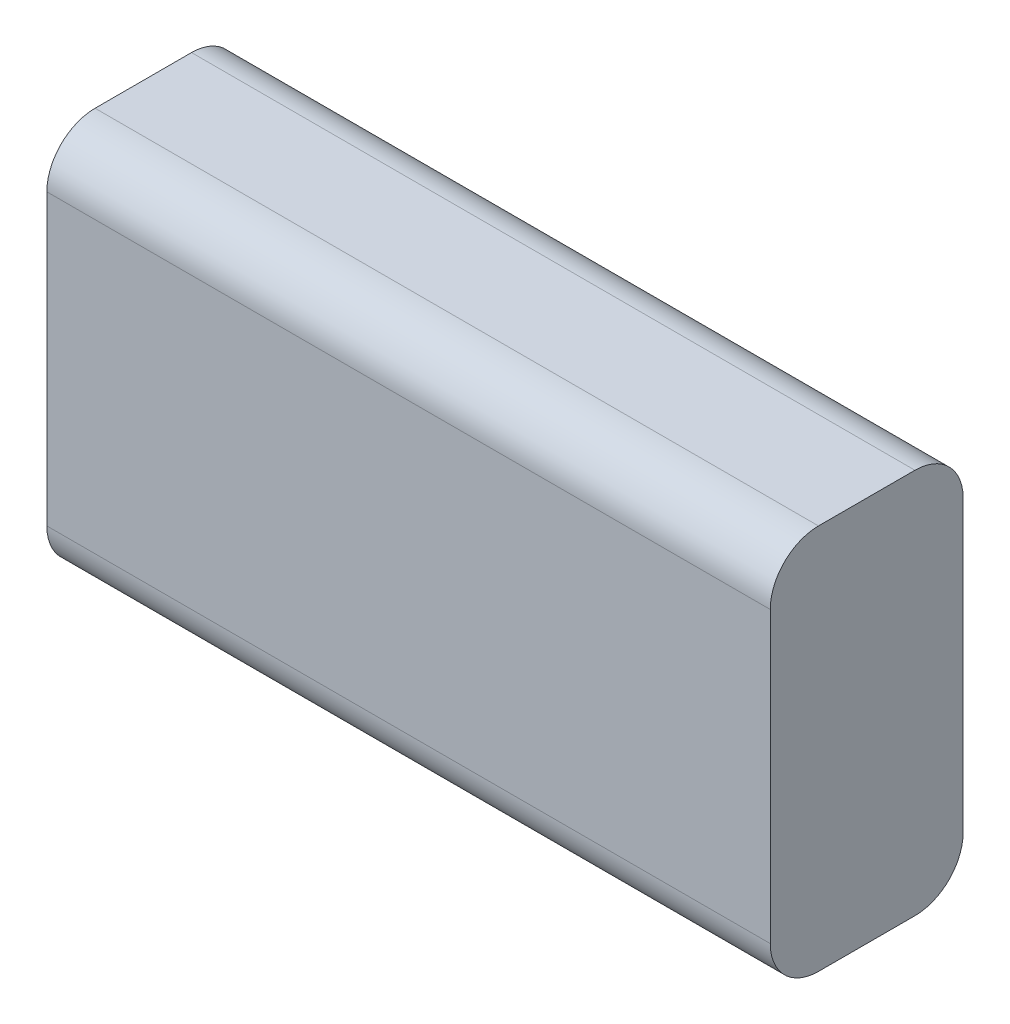
ISO-10303-21;
HEADER;
FILE_DESCRIPTION(('STEP AP214'),'2;1');
FILE_NAME('part.step','',(''),(''),'','','');
FILE_SCHEMA(('AUTOMOTIVE_DESIGN { 1 0 10303 214 1 1 1 1 }'));
ENDSEC;
DATA;
#1=APPLICATION_CONTEXT('core data for automotive mechanical design processes');
#2=APPLICATION_PROTOCOL_DEFINITION('international standard','automotive_design',2000,#1);
#3=PRODUCT_CONTEXT('',#1,'mechanical');
#4=PRODUCT('Part','Part','',(#3));
#5=PRODUCT_RELATED_PRODUCT_CATEGORY('part','',(#4));
#6=PRODUCT_DEFINITION_FORMATION('','',#4);
#7=PRODUCT_DEFINITION_CONTEXT('part definition',#1,'design');
#8=PRODUCT_DEFINITION('design','',#6,#7);
#9=PRODUCT_DEFINITION_SHAPE('','',#8);
#10=(LENGTH_UNIT() NAMED_UNIT(*) SI_UNIT(.MILLI.,.METRE.));
#11=(NAMED_UNIT(*) PLANE_ANGLE_UNIT() SI_UNIT($,.RADIAN.));
#12=(NAMED_UNIT(*) SI_UNIT($,.STERADIAN.) SOLID_ANGLE_UNIT());
#13=UNCERTAINTY_MEASURE_WITH_UNIT(LENGTH_MEASURE(1.E-05),#10,'distance_accuracy_value','');
#14=(GEOMETRIC_REPRESENTATION_CONTEXT(3) GLOBAL_UNCERTAINTY_ASSIGNED_CONTEXT((#13)) GLOBAL_UNIT_ASSIGNED_CONTEXT((#10,
#11,#12)) REPRESENTATION_CONTEXT('',''));
#15=CARTESIAN_POINT('',(0.,0.,0.));
#16=DIRECTION('',(0.,0.,1.));
#17=DIRECTION('',(1.,0.,0.));
#18=AXIS2_PLACEMENT_3D('',#15,#16,#17);
#19=CARTESIAN_POINT('',(37.5,-20.,20.));
#20=DIRECTION('',(-1.,0.,0.));
#21=DIRECTION('',(0.,0.,1.));
#22=AXIS2_PLACEMENT_3D('',#19,#20,#21);
#23=PLANE('',#22);
#24=DIRECTION('',(0.,0.,-1.));
#25=VECTOR('',#24,1.);
#26=CARTESIAN_POINT('',(37.5,-20.,20.));
#27=LINE('',#26,#25);
#28=CARTESIAN_POINT('',(37.5,-20.,15.));
#29=VERTEX_POINT('',#28);
#30=CARTESIAN_POINT('',(37.5,-20.,5.));
#31=VERTEX_POINT('',#30);
#32=EDGE_CURVE('E115',#29,#31,#27,.T.);
#33=ORIENTED_EDGE('',*,*,#32,.T.);
#34=CARTESIAN_POINT('',(37.5,-15.,5.));
#35=DIRECTION('',(-1.,0.,0.));
#36=DIRECTION('',(0.,0.,1.));
#37=AXIS2_PLACEMENT_3D('',#34,#35,#36);
#38=CIRCLE('',#37,5.);
#39=CARTESIAN_POINT('',(37.5,-15.,0.));
#40=VERTEX_POINT('',#39);
#41=EDGE_CURVE('E155',#31,#40,#38,.F.);
#42=ORIENTED_EDGE('',*,*,#41,.T.);
#43=DIRECTION('',(0.,1.,0.));
#44=VECTOR('',#43,1.);
#45=CARTESIAN_POINT('',(37.5,-20.,0.));
#46=LINE('',#45,#44);
#47=CARTESIAN_POINT('',(37.5,15.,0.));
#48=VERTEX_POINT('',#47);
#49=EDGE_CURVE('E189',#40,#48,#46,.T.);
#50=ORIENTED_EDGE('',*,*,#49,.T.);
#51=CARTESIAN_POINT('',(37.5,15.,5.));
#52=DIRECTION('',(-1.,0.,0.));
#53=DIRECTION('',(0.,0.,1.));
#54=AXIS2_PLACEMENT_3D('',#51,#52,#53);
#55=CIRCLE('',#54,5.);
#56=CARTESIAN_POINT('',(37.5,20.,5.));
#57=VERTEX_POINT('',#56);
#58=EDGE_CURVE('E152',#48,#57,#55,.F.);
#59=ORIENTED_EDGE('',*,*,#58,.T.);
#60=DIRECTION('',(0.,0.,-1.));
#61=VECTOR('',#60,1.);
#62=CARTESIAN_POINT('',(37.5,20.,20.));
#63=LINE('',#62,#61);
#64=CARTESIAN_POINT('',(37.5,20.,15.));
#65=VERTEX_POINT('',#64);
#66=EDGE_CURVE('E140',#65,#57,#63,.T.);
#67=ORIENTED_EDGE('',*,*,#66,.F.);
#68=CARTESIAN_POINT('',(37.5,15.,15.));
#69=DIRECTION('',(-1.,0.,0.));
#70=DIRECTION('',(0.,0.,1.));
#71=AXIS2_PLACEMENT_3D('',#68,#69,#70);
#72=CIRCLE('',#71,5.);
#73=CARTESIAN_POINT('',(37.5,15.,20.));
#74=VERTEX_POINT('',#73);
#75=EDGE_CURVE('E123',#65,#74,#72,.F.);
#76=ORIENTED_EDGE('',*,*,#75,.T.);
#77=DIRECTION('',(0.,1.,0.));
#78=VECTOR('',#77,1.);
#79=CARTESIAN_POINT('',(37.5,-20.,20.));
#80=LINE('',#79,#78);
#81=CARTESIAN_POINT('',(37.5,-15.,20.));
#82=VERTEX_POINT('',#81);
#83=EDGE_CURVE('E117',#82,#74,#80,.T.);
#84=ORIENTED_EDGE('',*,*,#83,.F.);
#85=CARTESIAN_POINT('',(37.5,-15.,15.));
#86=DIRECTION('',(-1.,0.,0.));
#87=DIRECTION('',(0.,0.,1.));
#88=AXIS2_PLACEMENT_3D('',#85,#86,#87);
#89=CIRCLE('',#88,5.);
#90=EDGE_CURVE('E113',#82,#29,#89,.F.);
#91=ORIENTED_EDGE('',*,*,#90,.T.);
#92=EDGE_LOOP('',(#33,#42,#50,#59,#67,#76,#84,#91));
#93=FACE_BOUND('',#92,.T.);
#94=ADVANCED_FACE('F45',(#93),#23,.F.);
#95=CARTESIAN_POINT('',(-37.5,20.,20.));
#96=DIRECTION('',(0.,-1.,0.));
#97=DIRECTION('',(0.,0.,-1.));
#98=AXIS2_PLACEMENT_3D('',#95,#96,#97);
#99=PLANE('',#98);
#100=ORIENTED_EDGE('',*,*,#66,.T.);
#101=DIRECTION('',(-1.,0.,0.));
#102=VECTOR('',#101,1.);
#103=CARTESIAN_POINT('',(-37.5,20.,5.));
#104=LINE('',#103,#102);
#105=CARTESIAN_POINT('',(-37.5,20.,5.));
#106=VERTEX_POINT('',#105);
#107=EDGE_CURVE('E176',#57,#106,#104,.T.);
#108=ORIENTED_EDGE('',*,*,#107,.T.);
#109=DIRECTION('',(0.,0.,-1.));
#110=VECTOR('',#109,1.);
#111=CARTESIAN_POINT('',(-37.5,20.,20.));
#112=LINE('',#111,#110);
#113=CARTESIAN_POINT('',(-37.5,20.,15.));
#114=VERTEX_POINT('',#113);
#115=EDGE_CURVE('E146',#114,#106,#112,.T.);
#116=ORIENTED_EDGE('',*,*,#115,.F.);
#117=DIRECTION('',(-1.,0.,0.));
#118=VECTOR('',#117,1.);
#119=CARTESIAN_POINT('',(-37.5,20.,15.));
#120=LINE('',#119,#118);
#121=EDGE_CURVE('E173',#114,#65,#120,.F.);
#122=ORIENTED_EDGE('',*,*,#121,.T.);
#123=EDGE_LOOP('',(#100,#108,#116,#122));
#124=FACE_BOUND('',#123,.T.);
#125=ADVANCED_FACE('F202',(#124),#99,.F.);
#126=CARTESIAN_POINT('',(-37.5,-20.,20.));
#127=DIRECTION('',(1.,0.,0.));
#128=DIRECTION('',(0.,0.,-1.));
#129=AXIS2_PLACEMENT_3D('',#126,#127,#128);
#130=PLANE('',#129);
#131=DIRECTION('',(0.,-1.,0.));
#132=VECTOR('',#131,1.);
#133=CARTESIAN_POINT('',(-37.5,-20.,0.));
#134=LINE('',#133,#132);
#135=CARTESIAN_POINT('',(-37.5,15.,0.));
#136=VERTEX_POINT('',#135);
#137=CARTESIAN_POINT('',(-37.5,-15.,0.));
#138=VERTEX_POINT('',#137);
#139=EDGE_CURVE('E186',#136,#138,#134,.T.);
#140=ORIENTED_EDGE('',*,*,#139,.T.);
#141=CARTESIAN_POINT('',(-37.5,-15.,5.));
#142=DIRECTION('',(1.,0.,0.));
#143=DIRECTION('',(0.,0.,-1.));
#144=AXIS2_PLACEMENT_3D('',#141,#142,#143);
#145=CIRCLE('',#144,5.);
#146=CARTESIAN_POINT('',(-37.5,-20.,5.));
#147=VERTEX_POINT('',#146);
#148=EDGE_CURVE('E170',#138,#147,#145,.F.);
#149=ORIENTED_EDGE('',*,*,#148,.T.);
#150=DIRECTION('',(0.,0.,-1.));
#151=VECTOR('',#150,1.);
#152=CARTESIAN_POINT('',(-37.5,-20.,20.));
#153=LINE('',#152,#151);
#154=CARTESIAN_POINT('',(-37.5,-20.,15.));
#155=VERTEX_POINT('',#154);
#156=EDGE_CURVE('E134',#155,#147,#153,.T.);
#157=ORIENTED_EDGE('',*,*,#156,.F.);
#158=CARTESIAN_POINT('',(-37.5,-15.,15.));
#159=DIRECTION('',(1.,0.,0.));
#160=DIRECTION('',(0.,0.,-1.));
#161=AXIS2_PLACEMENT_3D('',#158,#159,#160);
#162=CIRCLE('',#161,5.);
#163=CARTESIAN_POINT('',(-37.5,-15.,20.));
#164=VERTEX_POINT('',#163);
#165=EDGE_CURVE('E138',#155,#164,#162,.F.);
#166=ORIENTED_EDGE('',*,*,#165,.T.);
#167=DIRECTION('',(0.,-1.,0.));
#168=VECTOR('',#167,1.);
#169=CARTESIAN_POINT('',(-37.5,-20.,20.));
#170=LINE('',#169,#168);
#171=CARTESIAN_POINT('',(-37.5,15.,20.));
#172=VERTEX_POINT('',#171);
#173=EDGE_CURVE('E135',#172,#164,#170,.T.);
#174=ORIENTED_EDGE('',*,*,#173,.F.);
#175=CARTESIAN_POINT('',(-37.5,15.,15.));
#176=DIRECTION('',(1.,0.,0.));
#177=DIRECTION('',(0.,0.,-1.));
#178=AXIS2_PLACEMENT_3D('',#175,#176,#177);
#179=CIRCLE('',#178,5.);
#180=EDGE_CURVE('E69',#172,#114,#179,.F.);
#181=ORIENTED_EDGE('',*,*,#180,.T.);
#182=ORIENTED_EDGE('',*,*,#115,.T.);
#183=CARTESIAN_POINT('',(-37.5,15.,5.));
#184=DIRECTION('',(1.,0.,0.));
#185=DIRECTION('',(0.,0.,-1.));
#186=AXIS2_PLACEMENT_3D('',#183,#184,#185);
#187=CIRCLE('',#186,5.);
#188=EDGE_CURVE('E61',#106,#136,#187,.F.);
#189=ORIENTED_EDGE('',*,*,#188,.T.);
#190=EDGE_LOOP('',(#140,#149,#157,#166,#174,#181,#182,#189));
#191=FACE_BOUND('',#190,.T.);
#192=ADVANCED_FACE('F198',(#191),#130,.F.);
#193=CARTESIAN_POINT('',(-37.5,-20.,20.));
#194=DIRECTION('',(0.,1.,0.));
#195=DIRECTION('',(0.,0.,1.));
#196=AXIS2_PLACEMENT_3D('',#193,#194,#195);
#197=PLANE('',#196);
#198=ORIENTED_EDGE('',*,*,#156,.T.);
#199=DIRECTION('',(1.,0.,0.));
#200=VECTOR('',#199,1.);
#201=CARTESIAN_POINT('',(37.5,-20.,5.));
#202=LINE('',#201,#200);
#203=EDGE_CURVE('E124',#147,#31,#202,.T.);
#204=ORIENTED_EDGE('',*,*,#203,.T.);
#205=ORIENTED_EDGE('',*,*,#32,.F.);
#206=DIRECTION('',(1.,0.,0.));
#207=VECTOR('',#206,1.);
#208=CARTESIAN_POINT('',(-37.5,-20.,15.));
#209=LINE('',#208,#207);
#210=EDGE_CURVE('E130',#29,#155,#209,.F.);
#211=ORIENTED_EDGE('',*,*,#210,.T.);
#212=EDGE_LOOP('',(#198,#204,#205,#211));
#213=FACE_BOUND('',#212,.T.);
#214=ADVANCED_FACE('F129',(#213),#197,.F.);
#215=CARTESIAN_POINT('',(0.,0.,20.));
#216=DIRECTION('',(0.,0.,-1.));
#217=DIRECTION('',(-1.,0.,0.));
#218=AXIS2_PLACEMENT_3D('',#215,#216,#217);
#219=PLANE('',#218);
#220=ORIENTED_EDGE('',*,*,#83,.T.);
#221=DIRECTION('',(-1.,0.,0.));
#222=VECTOR('',#221,1.);
#223=CARTESIAN_POINT('',(0.,15.,20.));
#224=LINE('',#223,#222);
#225=EDGE_CURVE('E11',#74,#172,#224,.T.);
#226=ORIENTED_EDGE('',*,*,#225,.T.);
#227=ORIENTED_EDGE('',*,*,#173,.T.);
#228=DIRECTION('',(1.,0.,0.));
#229=VECTOR('',#228,1.);
#230=CARTESIAN_POINT('',(0.,-15.,20.));
#231=LINE('',#230,#229);
#232=EDGE_CURVE('E54',#164,#82,#231,.T.);
#233=ORIENTED_EDGE('',*,*,#232,.T.);
#234=EDGE_LOOP('',(#220,#226,#227,#233));
#235=FACE_BOUND('',#234,.T.);
#236=ADVANCED_FACE('F181',(#235),#219,.F.);
#237=CARTESIAN_POINT('',(0.,0.,0.));
#238=DIRECTION('',(0.,0.,-1.));
#239=DIRECTION('',(-1.,0.,0.));
#240=AXIS2_PLACEMENT_3D('',#237,#238,#239);
#241=PLANE('',#240);
#242=ORIENTED_EDGE('',*,*,#49,.F.);
#243=DIRECTION('',(1.,0.,0.));
#244=VECTOR('',#243,1.);
#245=CARTESIAN_POINT('',(-37.5,-15.,0.));
#246=LINE('',#245,#244);
#247=EDGE_CURVE('E161',#40,#138,#246,.F.);
#248=ORIENTED_EDGE('',*,*,#247,.T.);
#249=ORIENTED_EDGE('',*,*,#139,.F.);
#250=DIRECTION('',(-1.,0.,0.));
#251=VECTOR('',#250,1.);
#252=CARTESIAN_POINT('',(37.5,15.,0.));
#253=LINE('',#252,#251);
#254=EDGE_CURVE('E158',#136,#48,#253,.F.);
#255=ORIENTED_EDGE('',*,*,#254,.T.);
#256=EDGE_LOOP('',(#242,#248,#249,#255));
#257=FACE_BOUND('',#256,.T.);
#258=ADVANCED_FACE('F211',(#257),#241,.T.);
#259=CARTESIAN_POINT('',(-37.5,-15.,5.));
#260=DIRECTION('',(-1.,0.,0.));
#261=DIRECTION('',(0.,0.,1.));
#262=AXIS2_PLACEMENT_3D('',#259,#260,#261);
#263=CYLINDRICAL_SURFACE('',#262,5.);
#264=ORIENTED_EDGE('',*,*,#148,.F.);
#265=ORIENTED_EDGE('',*,*,#247,.F.);
#266=ORIENTED_EDGE('',*,*,#41,.F.);
#267=ORIENTED_EDGE('',*,*,#203,.F.);
#268=EDGE_LOOP('',(#264,#265,#266,#267));
#269=FACE_BOUND('',#268,.T.);
#270=ADVANCED_FACE('F215',(#269),#263,.T.);
#271=CARTESIAN_POINT('',(-37.5,15.,5.));
#272=DIRECTION('',(1.,0.,0.));
#273=DIRECTION('',(0.,0.,-1.));
#274=AXIS2_PLACEMENT_3D('',#271,#272,#273);
#275=CYLINDRICAL_SURFACE('',#274,5.);
#276=ORIENTED_EDGE('',*,*,#58,.F.);
#277=ORIENTED_EDGE('',*,*,#254,.F.);
#278=ORIENTED_EDGE('',*,*,#188,.F.);
#279=ORIENTED_EDGE('',*,*,#107,.F.);
#280=EDGE_LOOP('',(#276,#277,#278,#279));
#281=FACE_BOUND('',#280,.T.);
#282=ADVANCED_FACE('F208',(#281),#275,.T.);
#283=CARTESIAN_POINT('',(0.,15.,15.));
#284=DIRECTION('',(-1.,0.,0.));
#285=DIRECTION('',(0.,0.,1.));
#286=AXIS2_PLACEMENT_3D('',#283,#284,#285);
#287=CYLINDRICAL_SURFACE('',#286,5.);
#288=ORIENTED_EDGE('',*,*,#75,.F.);
#289=ORIENTED_EDGE('',*,*,#121,.F.);
#290=ORIENTED_EDGE('',*,*,#180,.F.);
#291=ORIENTED_EDGE('',*,*,#225,.F.);
#292=EDGE_LOOP('',(#288,#289,#290,#291));
#293=FACE_BOUND('',#292,.T.);
#294=ADVANCED_FACE('F206',(#293),#287,.T.);
#295=CARTESIAN_POINT('',(0.,-15.,15.));
#296=DIRECTION('',(1.,0.,0.));
#297=DIRECTION('',(0.,0.,-1.));
#298=AXIS2_PLACEMENT_3D('',#295,#296,#297);
#299=CYLINDRICAL_SURFACE('',#298,5.);
#300=ORIENTED_EDGE('',*,*,#165,.F.);
#301=ORIENTED_EDGE('',*,*,#210,.F.);
#302=ORIENTED_EDGE('',*,*,#90,.F.);
#303=ORIENTED_EDGE('',*,*,#232,.F.);
#304=EDGE_LOOP('',(#300,#301,#302,#303));
#305=FACE_BOUND('',#304,.T.);
#306=ADVANCED_FACE('F47',(#305),#299,.T.);
#307=CLOSED_SHELL('',(#94,#125,#192,#214,#236,#258,#270,#282,#294,#306));
#308=MANIFOLD_SOLID_BREP('B2',#307);
#309=ADVANCED_BREP_SHAPE_REPRESENTATION('',(#18,#308),#14);
#310=SHAPE_DEFINITION_REPRESENTATION(#9,#309);
ENDSEC;
END-ISO-10303-21;
